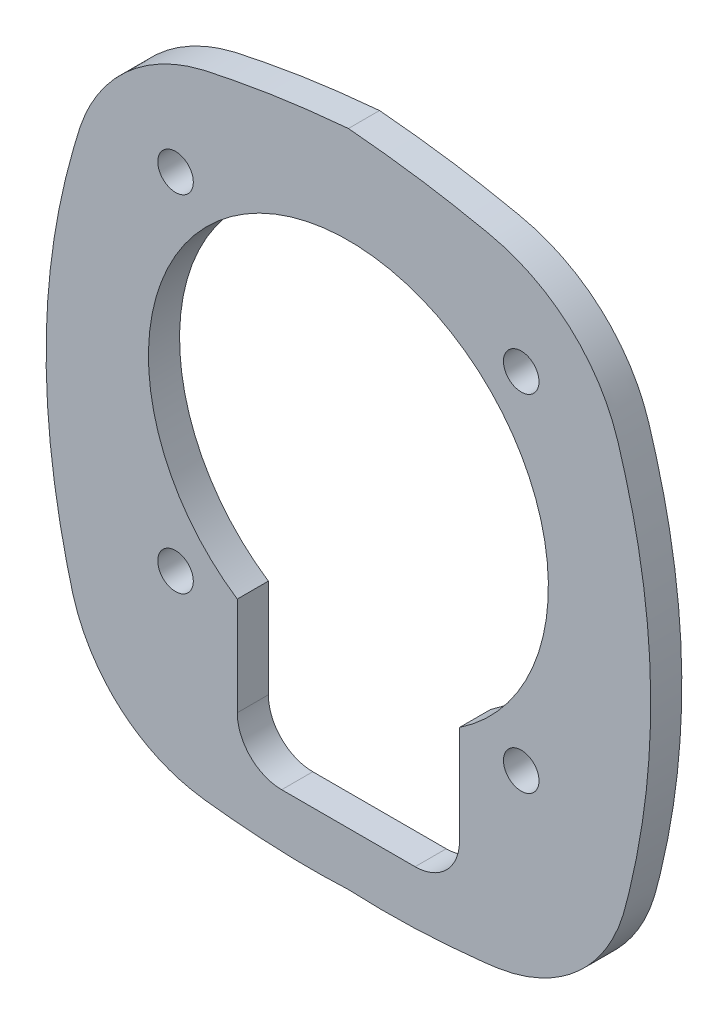
ISO-10303-21;
HEADER;
FILE_DESCRIPTION(('STEP AP214'),'2;1');
FILE_NAME('part.step','',(''),(''),'','','');
FILE_SCHEMA(('AUTOMOTIVE_DESIGN { 1 0 10303 214 1 1 1 1 }'));
ENDSEC;
DATA;
#1=APPLICATION_CONTEXT('core data for automotive mechanical design processes');
#2=APPLICATION_PROTOCOL_DEFINITION('international standard','automotive_design',2000,#1);
#3=PRODUCT_CONTEXT('',#1,'mechanical');
#4=PRODUCT('Part','Part','',(#3));
#5=PRODUCT_RELATED_PRODUCT_CATEGORY('part','',(#4));
#6=PRODUCT_DEFINITION_FORMATION('','',#4);
#7=PRODUCT_DEFINITION_CONTEXT('part definition',#1,'design');
#8=PRODUCT_DEFINITION('design','',#6,#7);
#9=PRODUCT_DEFINITION_SHAPE('','',#8);
#10=(LENGTH_UNIT() NAMED_UNIT(*) SI_UNIT(.MILLI.,.METRE.));
#11=(NAMED_UNIT(*) PLANE_ANGLE_UNIT() SI_UNIT($,.RADIAN.));
#12=(NAMED_UNIT(*) SI_UNIT($,.STERADIAN.) SOLID_ANGLE_UNIT());
#13=UNCERTAINTY_MEASURE_WITH_UNIT(LENGTH_MEASURE(1.E-05),#10,'distance_accuracy_value','');
#14=(GEOMETRIC_REPRESENTATION_CONTEXT(3) GLOBAL_UNCERTAINTY_ASSIGNED_CONTEXT((#13)) GLOBAL_UNIT_ASSIGNED_CONTEXT((#10,
#11,#12)) REPRESENTATION_CONTEXT('',''));
#15=CARTESIAN_POINT('',(0.,0.,0.));
#16=DIRECTION('',(0.,0.,1.));
#17=DIRECTION('',(1.,0.,0.));
#18=AXIS2_PLACEMENT_3D('',#15,#16,#17);
#19=CARTESIAN_POINT('',(0.00054299993692983,130.358525826866,1.4));
#20=CARTESIAN_POINT('',(-1.94548045190582,130.188499041734,1.4));
#21=CARTESIAN_POINT('',(-4.85838125316113,129.868758565136,1.4));
#22=CARTESIAN_POINT('',(-8.72241348746512,129.258161877485,1.4));
#23=CARTESIAN_POINT('',(-11.1223479499157,128.79259530496,1.4));
#24=CARTESIAN_POINT('',(-13.0358684318198,128.409370125319,1.4));
#25=CARTESIAN_POINT('',(-15.0232197505455,127.849253360925,1.4));
#26=CARTESIAN_POINT('',(-17.3517729758326,126.800885079784,1.4));
#27=CARTESIAN_POINT('',(-19.8740124159007,125.013083486646,1.4));
#28=CARTESIAN_POINT('',(-21.9836929339057,122.745525762715,1.4));
#29=CARTESIAN_POINT('',(-23.315799927982,120.550392171529,1.4));
#30=CARTESIAN_POINT('',(-24.0970656523542,118.633733215078,1.4));
#31=CARTESIAN_POINT('',(-24.6644840943337,116.740013737951,1.4));
#32=CARTESIAN_POINT('',(-25.3246455713415,114.384544217366,1.4));
#33=CARTESIAN_POINT('',(-26.1998346574846,110.552455159737,1.4));
#34=CARTESIAN_POINT('',(-26.9602033243545,105.695351510189,1.4));
#35=CARTESIAN_POINT('',(-27.3032190255383,99.799698553992,1.4));
#36=CARTESIAN_POINT('',(-27.1111267756914,94.8853222176447,1.4));
#37=CARTESIAN_POINT('',(-26.6923251134672,90.9810374384789,1.4));
#38=CARTESIAN_POINT('',(-26.2472832330215,88.0691838092408,1.4));
#39=CARTESIAN_POINT('',(-25.7782550087314,85.666957643433,1.4));
#40=CARTESIAN_POINT('',(-25.3390188687473,83.7483132972807,1.4));
#41=CARTESIAN_POINT('',(-24.9959659621823,82.3390638678443,1.4));
#42=CARTESIAN_POINT('',(-24.5760097029026,80.8595948727171,1.4));
#43=CARTESIAN_POINT('',(-23.7922149835983,78.961000016101,1.4));
#44=CARTESIAN_POINT('',(-22.4474494101588,76.7543305101135,1.4));
#45=CARTESIAN_POINT('',(-20.2746228224085,74.5172981645998,1.4));
#46=CARTESIAN_POINT('',(-17.6592329689269,72.8343581699906,1.4));
#47=CARTESIAN_POINT('',(-15.232095848419,71.94673096763,1.4));
#48=CARTESIAN_POINT('',(-13.2018471792175,71.5690279829804,1.4));
#49=CARTESIAN_POINT('',(-11.2484200492786,71.3654921754065,1.4));
#50=CARTESIAN_POINT('',(-8.8190330044732,71.1349679085005,1.4));
#51=CARTESIAN_POINT('',(-5.88212968687609,70.975232523235,1.4));
#52=CARTESIAN_POINT('',(-2.94056055903832,70.9248960887929,1.4));
#53=CARTESIAN_POINT('',(-0.980653766512998,70.9864573687039,1.4));
#54=CARTESIAN_POINT('',(-0.00147850116347067,71.0305909363643,1.4));
#55=B_SPLINE_CURVE_WITH_KNOTS('',3,(#19,#20,#21,#22,#23,#24,#25,#26,#27,#28,#29,#30,#31,#32,#33,
#34,#35,#36,#37,#38,#39,#40,#41,#42,#43,#44,#45,#46,#47,#48,#49,#50,#51,#52,#53,#54),
.UNSPECIFIED.,.F.,.F.,(4,1,1,1,1,1,1,1,1,1,1,1,1,1,1,1,1,1,1,1,1,1,1,1,1,1,1,1,1,1,1,1,1,4),
(-0.000757093376789677,0.0617650105254969,0.0930260624766402,0.124287114427783,
0.139917640403355,0.155548166378927,0.18680921833007,0.218070270281213,0.249331322232357,
0.2805923741835,0.296222900159072,0.311853426134643,0.343114478085787,0.37437553003693,
0.436897633939216,0.499419737841503,0.56194184174379,0.593202893694933,0.624463945646076,
0.655724997597219,0.671355523572791,0.686986049548363,0.702616575523934,0.718247101499506,
0.749508153450649,0.780769205401793,0.812030257352936,0.843291309304079,0.858921835279651,
0.874552361255223,0.905813413206366,0.937074465157509,0.968335517108652,0.999596569059796),.UNSPECIFIED.);
#56=DIRECTION('',(0.,0.,-1.));
#57=VECTOR('',#56,1.);
#58=SURFACE_OF_LINEAR_EXTRUSION('',#55,#57);
#59=CARTESIAN_POINT('',(0.00054299993692983,130.358525826866,-1.4));
#60=CARTESIAN_POINT('',(-1.94548045190582,130.188499041734,-1.4));
#61=CARTESIAN_POINT('',(-4.85838125316113,129.868758565136,-1.4));
#62=CARTESIAN_POINT('',(-8.72241348746512,129.258161877485,-1.4));
#63=CARTESIAN_POINT('',(-11.1223479499157,128.79259530496,-1.4));
#64=CARTESIAN_POINT('',(-13.0358684318198,128.409370125319,-1.4));
#65=CARTESIAN_POINT('',(-15.0232197505455,127.849253360925,-1.4));
#66=CARTESIAN_POINT('',(-17.3517729758326,126.800885079784,-1.4));
#67=CARTESIAN_POINT('',(-19.8740124159007,125.013083486646,-1.4));
#68=CARTESIAN_POINT('',(-21.9836929339057,122.745525762715,-1.4));
#69=CARTESIAN_POINT('',(-23.315799927982,120.550392171529,-1.4));
#70=CARTESIAN_POINT('',(-24.0970656523542,118.633733215078,-1.4));
#71=CARTESIAN_POINT('',(-24.6644840943337,116.740013737951,-1.4));
#72=CARTESIAN_POINT('',(-25.3246455713415,114.384544217366,-1.4));
#73=CARTESIAN_POINT('',(-26.1998346574846,110.552455159737,-1.4));
#74=CARTESIAN_POINT('',(-26.9602033243545,105.695351510189,-1.4));
#75=CARTESIAN_POINT('',(-27.3032190255383,99.799698553992,-1.4));
#76=CARTESIAN_POINT('',(-27.1111267756914,94.8853222176447,-1.4));
#77=CARTESIAN_POINT('',(-26.6923251134672,90.9810374384789,-1.4));
#78=CARTESIAN_POINT('',(-26.2472832330215,88.0691838092408,-1.4));
#79=CARTESIAN_POINT('',(-25.7782550087314,85.666957643433,-1.4));
#80=CARTESIAN_POINT('',(-25.3390188687473,83.7483132972807,-1.4));
#81=CARTESIAN_POINT('',(-24.9959659621823,82.3390638678443,-1.4));
#82=CARTESIAN_POINT('',(-24.5760097029026,80.8595948727171,-1.4));
#83=CARTESIAN_POINT('',(-23.7922149835983,78.961000016101,-1.4));
#84=CARTESIAN_POINT('',(-22.4474494101588,76.7543305101135,-1.4));
#85=CARTESIAN_POINT('',(-20.2746228224085,74.5172981645998,-1.4));
#86=CARTESIAN_POINT('',(-17.6592329689269,72.8343581699906,-1.4));
#87=CARTESIAN_POINT('',(-15.232095848419,71.94673096763,-1.4));
#88=CARTESIAN_POINT('',(-13.2018471792175,71.5690279829804,-1.4));
#89=CARTESIAN_POINT('',(-11.2484200492786,71.3654921754065,-1.4));
#90=CARTESIAN_POINT('',(-8.8190330044732,71.1349679085005,-1.4));
#91=CARTESIAN_POINT('',(-5.88212968687609,70.975232523235,-1.4));
#92=CARTESIAN_POINT('',(-2.94056055903832,70.9248960887929,-1.4));
#93=CARTESIAN_POINT('',(-0.980653766512998,70.9864573687039,-1.4));
#94=CARTESIAN_POINT('',(-0.00147850116347067,71.0305909363643,-1.4));
#95=B_SPLINE_CURVE_WITH_KNOTS('',3,(#59,#60,#61,#62,#63,#64,#65,#66,#67,#68,#69,#70,#71,#72,#73,
#74,#75,#76,#77,#78,#79,#80,#81,#82,#83,#84,#85,#86,#87,#88,#89,#90,#91,#92,#93,#94),
.UNSPECIFIED.,.F.,.F.,(4,1,1,1,1,1,1,1,1,1,1,1,1,1,1,1,1,1,1,1,1,1,1,1,1,1,1,1,1,1,1,1,1,4),
(-0.000757093376789677,0.0617650105254969,0.0930260624766402,0.124287114427783,
0.139917640403355,0.155548166378927,0.18680921833007,0.218070270281213,0.249331322232357,
0.2805923741835,0.296222900159072,0.311853426134643,0.343114478085787,0.37437553003693,
0.436897633939216,0.499419737841503,0.56194184174379,0.593202893694933,0.624463945646076,
0.655724997597219,0.671355523572791,0.686986049548363,0.702616575523934,0.718247101499506,
0.749508153450649,0.780769205401793,0.812030257352936,0.843291309304079,0.858921835279651,
0.874552361255223,0.905813413206366,0.937074465157509,0.968335517108652,0.999596569059796),.UNSPECIFIED.);
#96=CARTESIAN_POINT('',(0.00054299993692983,130.358525826866,-1.4));
#97=VERTEX_POINT('',#96);
#98=CARTESIAN_POINT('',(-0.00147850116347067,71.0305909363643,-1.4));
#99=VERTEX_POINT('',#98);
#100=EDGE_CURVE('E318',#97,#99,#95,.T.);
#101=ORIENTED_EDGE('',*,*,#100,.T.);
#102=DIRECTION('',(0.,0.,-1.));
#103=VECTOR('',#102,1.);
#104=CARTESIAN_POINT('',(-0.00147850116347067,71.0305909363643,1.4));
#105=LINE('',#104,#103);
#106=CARTESIAN_POINT('',(-0.00147850116347067,71.0305909363643,1.4));
#107=VERTEX_POINT('',#106);
#108=EDGE_CURVE('E11',#107,#99,#105,.T.);
#109=ORIENTED_EDGE('',*,*,#108,.F.);
#110=CARTESIAN_POINT('',(0.00054299993692983,130.358525826866,1.4));
#111=VERTEX_POINT('',#110);
#112=EDGE_CURVE('E156',#111,#107,#55,.T.);
#113=ORIENTED_EDGE('',*,*,#112,.F.);
#114=DIRECTION('',(0.,0.,-1.));
#115=VECTOR('',#114,1.);
#116=CARTESIAN_POINT('',(0.00054299993692983,130.358525826866,1.4));
#117=LINE('',#116,#115);
#118=EDGE_CURVE('E50',#111,#97,#117,.T.);
#119=ORIENTED_EDGE('',*,*,#118,.T.);
#120=EDGE_LOOP('',(#101,#109,#113,#119));
#121=FACE_BOUND('',#120,.T.);
#122=ADVANCED_FACE('F39',(#121),#58,.F.);
#123=CARTESIAN_POINT('',(0.,75.8120442507033,1.4));
#124=DIRECTION('',(0.,1.,0.));
#125=DIRECTION('',(0.,0.,1.));
#126=AXIS2_PLACEMENT_3D('',#123,#124,#125);
#127=PLANE('',#126);
#128=DIRECTION('',(1.,0.,0.));
#129=VECTOR('',#128,1.);
#130=CARTESIAN_POINT('',(0.,75.8120442507033,-1.4));
#131=LINE('',#130,#129);
#132=CARTESIAN_POINT('',(-6.00491041095505,75.8120442507033,-1.4));
#133=VERTEX_POINT('',#132);
#134=CARTESIAN_POINT('',(6.00195340862822,75.8120442507033,-1.4));
#135=VERTEX_POINT('',#134);
#136=EDGE_CURVE('E305',#133,#135,#131,.T.);
#137=ORIENTED_EDGE('',*,*,#136,.F.);
#138=DIRECTION('',(0.,0.,-1.));
#139=VECTOR('',#138,1.);
#140=CARTESIAN_POINT('',(-6.00491041095505,75.8120442507033,1.4));
#141=LINE('',#140,#139);
#142=CARTESIAN_POINT('',(-6.00491041095505,75.8120442507033,1.4));
#143=VERTEX_POINT('',#142);
#144=EDGE_CURVE('E43',#143,#133,#141,.T.);
#145=ORIENTED_EDGE('',*,*,#144,.F.);
#146=DIRECTION('',(1.,0.,0.));
#147=VECTOR('',#146,1.);
#148=CARTESIAN_POINT('',(0.,75.8120442507033,1.4));
#149=LINE('',#148,#147);
#150=CARTESIAN_POINT('',(6.00195340862822,75.8120442507033,1.4));
#151=VERTEX_POINT('',#150);
#152=EDGE_CURVE('E123',#143,#151,#149,.T.);
#153=ORIENTED_EDGE('',*,*,#152,.T.);
#154=DIRECTION('',(0.,0.,-1.));
#155=VECTOR('',#154,1.);
#156=CARTESIAN_POINT('',(6.00195340862822,75.8120442507033,1.4));
#157=LINE('',#156,#155);
#158=EDGE_CURVE('E112',#151,#135,#157,.T.);
#159=ORIENTED_EDGE('',*,*,#158,.T.);
#160=EDGE_LOOP('',(#137,#145,#153,#159));
#161=FACE_BOUND('',#160,.T.);
#162=ADVANCED_FACE('F124',(#161),#127,.T.);
#163=CARTESIAN_POINT('',(-6.00491041095508,79.8120442507034,1.4));
#164=DIRECTION('',(0.,0.,-1.));
#165=DIRECTION('',(-1.,0.,0.));
#166=AXIS2_PLACEMENT_3D('',#163,#164,#165);
#167=CYLINDRICAL_SURFACE('',#166,4.);
#168=CARTESIAN_POINT('',(-6.00491041095508,79.8120442507034,-1.4));
#169=DIRECTION('',(0.,0.,1.));
#170=DIRECTION('',(1.,0.,0.));
#171=AXIS2_PLACEMENT_3D('',#168,#169,#170);
#172=CIRCLE('',#171,4.);
#173=CARTESIAN_POINT('',(-10.0049104109551,79.8120442507034,-1.4));
#174=VERTEX_POINT('',#173);
#175=EDGE_CURVE('E354',#133,#174,#172,.F.);
#176=ORIENTED_EDGE('',*,*,#175,.T.);
#177=DIRECTION('',(0.,0.,-1.));
#178=VECTOR('',#177,1.);
#179=CARTESIAN_POINT('',(-10.0049104109551,79.8120442507034,1.4));
#180=LINE('',#179,#178);
#181=CARTESIAN_POINT('',(-10.0049104109551,79.8120442507034,1.4));
#182=VERTEX_POINT('',#181);
#183=EDGE_CURVE('E347',#182,#174,#180,.T.);
#184=ORIENTED_EDGE('',*,*,#183,.F.);
#185=CARTESIAN_POINT('',(-6.00491041095508,79.8120442507034,1.4));
#186=DIRECTION('',(0.,0.,1.));
#187=DIRECTION('',(1.,0.,0.));
#188=AXIS2_PLACEMENT_3D('',#185,#186,#187);
#189=CIRCLE('',#188,4.);
#190=EDGE_CURVE('E128',#143,#182,#189,.F.);
#191=ORIENTED_EDGE('',*,*,#190,.F.);
#192=ORIENTED_EDGE('',*,*,#144,.T.);
#193=EDGE_LOOP('',(#176,#184,#191,#192));
#194=FACE_BOUND('',#193,.T.);
#195=ADVANCED_FACE('F201',(#194),#167,.F.);
#196=CARTESIAN_POINT('',(-10.0049104109551,0.,1.4));
#197=DIRECTION('',(-1.,0.,0.));
#198=DIRECTION('',(0.,0.,1.));
#199=AXIS2_PLACEMENT_3D('',#196,#197,#198);
#200=PLANE('',#199);
#201=DIRECTION('',(0.,1.,0.));
#202=VECTOR('',#201,1.);
#203=CARTESIAN_POINT('',(-10.0049104109551,0.,-1.4));
#204=LINE('',#203,#202);
#205=CARTESIAN_POINT('',(-10.0049104109551,88.6735975452472,-1.4));
#206=VERTEX_POINT('',#205);
#207=EDGE_CURVE('E356',#174,#206,#204,.T.);
#208=ORIENTED_EDGE('',*,*,#207,.T.);
#209=DIRECTION('',(0.,0.,-1.));
#210=VECTOR('',#209,1.);
#211=CARTESIAN_POINT('',(-10.0049104109551,88.6735975452472,1.4));
#212=LINE('',#211,#210);
#213=CARTESIAN_POINT('',(-10.0049104109551,88.6735975452472,1.4));
#214=VERTEX_POINT('',#213);
#215=EDGE_CURVE('E345',#214,#206,#212,.T.);
#216=ORIENTED_EDGE('',*,*,#215,.F.);
#217=DIRECTION('',(0.,1.,0.));
#218=VECTOR('',#217,1.);
#219=CARTESIAN_POINT('',(-10.0049104109551,0.,1.4));
#220=LINE('',#219,#218);
#221=EDGE_CURVE('E381',#182,#214,#220,.T.);
#222=ORIENTED_EDGE('',*,*,#221,.F.);
#223=ORIENTED_EDGE('',*,*,#183,.T.);
#224=EDGE_LOOP('',(#208,#216,#222,#223));
#225=FACE_BOUND('',#224,.T.);
#226=ADVANCED_FACE('F197',(#225),#200,.F.);
#227=CARTESIAN_POINT('',(0.,103.636945020621,1.4));
#228=DIRECTION('',(0.,0.,-1.));
#229=DIRECTION('',(-1.,0.,0.));
#230=AXIS2_PLACEMENT_3D('',#227,#228,#229);
#231=CYLINDRICAL_SURFACE('',#230,18.);
#232=CARTESIAN_POINT('',(0.,103.636945020621,-1.4));
#233=DIRECTION('',(0.,0.,1.));
#234=DIRECTION('',(1.,0.,0.));
#235=AXIS2_PLACEMENT_3D('',#232,#233,#234);
#236=CIRCLE('',#235,18.);
#237=CARTESIAN_POINT('',(10.0019534086282,88.6716208339673,-1.4));
#238=VERTEX_POINT('',#237);
#239=EDGE_CURVE('E365',#238,#206,#236,.T.);
#240=ORIENTED_EDGE('',*,*,#239,.F.);
#241=DIRECTION('',(0.,0.,-1.));
#242=VECTOR('',#241,1.);
#243=CARTESIAN_POINT('',(10.0019534086282,88.6716208339673,1.4));
#244=LINE('',#243,#242);
#245=CARTESIAN_POINT('',(10.0019534086282,88.6716208339673,1.4));
#246=VERTEX_POINT('',#245);
#247=EDGE_CURVE('E342',#246,#238,#244,.T.);
#248=ORIENTED_EDGE('',*,*,#247,.F.);
#249=CARTESIAN_POINT('',(0.,103.636945020621,1.4));
#250=DIRECTION('',(0.,0.,1.));
#251=DIRECTION('',(1.,0.,0.));
#252=AXIS2_PLACEMENT_3D('',#249,#250,#251);
#253=CIRCLE('',#252,18.);
#254=EDGE_CURVE('E145',#246,#214,#253,.T.);
#255=ORIENTED_EDGE('',*,*,#254,.T.);
#256=ORIENTED_EDGE('',*,*,#215,.T.);
#257=EDGE_LOOP('',(#240,#248,#255,#256));
#258=FACE_BOUND('',#257,.T.);
#259=ADVANCED_FACE('F193',(#258),#231,.F.);
#260=CARTESIAN_POINT('',(10.0019534086282,0.,1.4));
#261=DIRECTION('',(-1.,0.,0.));
#262=DIRECTION('',(0.,0.,1.));
#263=AXIS2_PLACEMENT_3D('',#260,#261,#262);
#264=PLANE('',#263);
#265=DIRECTION('',(0.,1.,0.));
#266=VECTOR('',#265,1.);
#267=CARTESIAN_POINT('',(10.0019534086282,0.,-1.4));
#268=LINE('',#267,#266);
#269=CARTESIAN_POINT('',(10.0019534086282,79.8120442507034,-1.4));
#270=VERTEX_POINT('',#269);
#271=EDGE_CURVE('E368',#270,#238,#268,.T.);
#272=ORIENTED_EDGE('',*,*,#271,.F.);
#273=DIRECTION('',(0.,0.,-1.));
#274=VECTOR('',#273,1.);
#275=CARTESIAN_POINT('',(10.0019534086282,79.8120442507034,1.4));
#276=LINE('',#275,#274);
#277=CARTESIAN_POINT('',(10.0019534086282,79.8120442507034,1.4));
#278=VERTEX_POINT('',#277);
#279=EDGE_CURVE('E120',#278,#270,#276,.T.);
#280=ORIENTED_EDGE('',*,*,#279,.F.);
#281=DIRECTION('',(0.,1.,0.));
#282=VECTOR('',#281,1.);
#283=CARTESIAN_POINT('',(10.0019534086282,0.,1.4));
#284=LINE('',#283,#282);
#285=EDGE_CURVE('E136',#278,#246,#284,.T.);
#286=ORIENTED_EDGE('',*,*,#285,.T.);
#287=ORIENTED_EDGE('',*,*,#247,.T.);
#288=EDGE_LOOP('',(#272,#280,#286,#287));
#289=FACE_BOUND('',#288,.T.);
#290=ADVANCED_FACE('F180',(#289),#264,.T.);
#291=CARTESIAN_POINT('',(-15.5593061884308,88.0805958345165,1.4));
#292=DIRECTION('',(0.,0.,-1.));
#293=DIRECTION('',(-1.,0.,0.));
#294=AXIS2_PLACEMENT_3D('',#291,#292,#293);
#295=CYLINDRICAL_SURFACE('',#294,1.6);
#296=CARTESIAN_POINT('',(-15.5593061884308,88.0805958345165,1.4));
#297=DIRECTION('',(0.,0.,1.));
#298=DIRECTION('',(1.,0.,0.));
#299=AXIS2_PLACEMENT_3D('',#296,#297,#298);
#300=CIRCLE('',#299,1.6);
#301=CARTESIAN_POINT('',(-13.9593061884308,88.0805958345165,1.4));
#302=VERTEX_POINT('',#301);
#303=EDGE_CURVE('E152',#302,#302,#300,.T.);
#304=ORIENTED_EDGE('',*,*,#303,.T.);
#305=EDGE_LOOP('',(#304));
#306=FACE_BOUND('',#305,.T.);
#307=CARTESIAN_POINT('',(-15.5593061884308,88.0805958345165,-1.4));
#308=DIRECTION('',(0.,0.,1.));
#309=DIRECTION('',(1.,0.,0.));
#310=AXIS2_PLACEMENT_3D('',#307,#308,#309);
#311=CIRCLE('',#310,1.6);
#312=CARTESIAN_POINT('',(-13.9593061884308,88.0805958345165,-1.4));
#313=VERTEX_POINT('',#312);
#314=EDGE_CURVE('E316',#313,#313,#311,.T.);
#315=ORIENTED_EDGE('',*,*,#314,.F.);
#316=EDGE_LOOP('',(#315));
#317=FACE_BOUND('',#316,.T.);
#318=ADVANCED_FACE('F176',(#306,#317),#295,.F.);
#319=CARTESIAN_POINT('',(-15.5593061884308,119.193294206725,1.4));
#320=DIRECTION('',(0.,0.,-1.));
#321=DIRECTION('',(-1.,0.,0.));
#322=AXIS2_PLACEMENT_3D('',#319,#320,#321);
#323=CYLINDRICAL_SURFACE('',#322,1.6);
#324=CARTESIAN_POINT('',(-15.5593061884308,119.193294206725,1.4));
#325=DIRECTION('',(0.,0.,1.));
#326=DIRECTION('',(1.,0.,0.));
#327=AXIS2_PLACEMENT_3D('',#324,#325,#326);
#328=CIRCLE('',#327,1.6);
#329=CARTESIAN_POINT('',(-13.9593061884308,119.193294206725,1.4));
#330=VERTEX_POINT('',#329);
#331=EDGE_CURVE('E143',#330,#330,#328,.F.);
#332=ORIENTED_EDGE('',*,*,#331,.F.);
#333=EDGE_LOOP('',(#332));
#334=FACE_BOUND('',#333,.T.);
#335=CARTESIAN_POINT('',(-15.5593061884308,119.193294206725,-1.4));
#336=DIRECTION('',(0.,0.,1.));
#337=DIRECTION('',(1.,0.,0.));
#338=AXIS2_PLACEMENT_3D('',#335,#336,#337);
#339=CIRCLE('',#338,1.6);
#340=CARTESIAN_POINT('',(-13.9593061884308,119.193294206725,-1.4));
#341=VERTEX_POINT('',#340);
#342=EDGE_CURVE('E313',#341,#341,#339,.F.);
#343=ORIENTED_EDGE('',*,*,#342,.T.);
#344=EDGE_LOOP('',(#343));
#345=FACE_BOUND('',#344,.T.);
#346=ADVANCED_FACE('F179',(#334,#345),#323,.F.);
#347=CARTESIAN_POINT('',(15.556349186104,119.193294206725,1.4));
#348=DIRECTION('',(0.,0.,-1.));
#349=DIRECTION('',(-1.,0.,0.));
#350=AXIS2_PLACEMENT_3D('',#347,#348,#349);
#351=CYLINDRICAL_SURFACE('',#350,1.6);
#352=CARTESIAN_POINT('',(15.556349186104,119.193294206725,1.4));
#353=DIRECTION('',(0.,0.,1.));
#354=DIRECTION('',(1.,0.,0.));
#355=AXIS2_PLACEMENT_3D('',#352,#353,#354);
#356=CIRCLE('',#355,1.6);
#357=CARTESIAN_POINT('',(17.156349186104,119.193294206725,1.4));
#358=VERTEX_POINT('',#357);
#359=EDGE_CURVE('E138',#358,#358,#356,.T.);
#360=ORIENTED_EDGE('',*,*,#359,.T.);
#361=EDGE_LOOP('',(#360));
#362=FACE_BOUND('',#361,.T.);
#363=CARTESIAN_POINT('',(15.556349186104,119.193294206725,-1.4));
#364=DIRECTION('',(0.,0.,1.));
#365=DIRECTION('',(1.,0.,0.));
#366=AXIS2_PLACEMENT_3D('',#363,#364,#365);
#367=CIRCLE('',#366,1.6);
#368=CARTESIAN_POINT('',(17.156349186104,119.193294206725,-1.4));
#369=VERTEX_POINT('',#368);
#370=EDGE_CURVE('E309',#369,#369,#367,.T.);
#371=ORIENTED_EDGE('',*,*,#370,.F.);
#372=EDGE_LOOP('',(#371));
#373=FACE_BOUND('',#372,.T.);
#374=ADVANCED_FACE('F184',(#362,#373),#351,.F.);
#375=CARTESIAN_POINT('',(6.00195340862825,79.8120442507034,1.4));
#376=DIRECTION('',(0.,0.,-1.));
#377=DIRECTION('',(-1.,0.,0.));
#378=AXIS2_PLACEMENT_3D('',#375,#376,#377);
#379=CYLINDRICAL_SURFACE('',#378,4.);
#380=CARTESIAN_POINT('',(6.00195340862825,79.8120442507034,-1.4));
#381=DIRECTION('',(0.,0.,1.));
#382=DIRECTION('',(1.,0.,0.));
#383=AXIS2_PLACEMENT_3D('',#380,#381,#382);
#384=CIRCLE('',#383,4.);
#385=EDGE_CURVE('E117',#135,#270,#384,.T.);
#386=ORIENTED_EDGE('',*,*,#385,.F.);
#387=ORIENTED_EDGE('',*,*,#158,.F.);
#388=CARTESIAN_POINT('',(6.00195340862825,79.8120442507034,1.4));
#389=DIRECTION('',(0.,0.,1.));
#390=DIRECTION('',(1.,0.,0.));
#391=AXIS2_PLACEMENT_3D('',#388,#389,#390);
#392=CIRCLE('',#391,4.);
#393=EDGE_CURVE('E115',#151,#278,#392,.T.);
#394=ORIENTED_EDGE('',*,*,#393,.T.);
#395=ORIENTED_EDGE('',*,*,#279,.T.);
#396=EDGE_LOOP('',(#386,#387,#394,#395));
#397=FACE_BOUND('',#396,.T.);
#398=ADVANCED_FACE('F113',(#397),#379,.F.);
#399=CARTESIAN_POINT('',(15.556349186104,88.0805958345165,1.4));
#400=DIRECTION('',(0.,0.,-1.));
#401=DIRECTION('',(-1.,0.,0.));
#402=AXIS2_PLACEMENT_3D('',#399,#400,#401);
#403=CYLINDRICAL_SURFACE('',#402,1.6);
#404=CARTESIAN_POINT('',(15.556349186104,88.0805958345165,1.4));
#405=DIRECTION('',(0.,0.,1.));
#406=DIRECTION('',(1.,0.,0.));
#407=AXIS2_PLACEMENT_3D('',#404,#405,#406);
#408=CIRCLE('',#407,1.6);
#409=CARTESIAN_POINT('',(17.156349186104,88.0805958345165,1.4));
#410=VERTEX_POINT('',#409);
#411=EDGE_CURVE('E129',#410,#410,#408,.F.);
#412=ORIENTED_EDGE('',*,*,#411,.F.);
#413=EDGE_LOOP('',(#412));
#414=FACE_BOUND('',#413,.T.);
#415=CARTESIAN_POINT('',(15.556349186104,88.0805958345165,-1.4));
#416=DIRECTION('',(0.,0.,1.));
#417=DIRECTION('',(1.,0.,0.));
#418=AXIS2_PLACEMENT_3D('',#415,#416,#417);
#419=CIRCLE('',#418,1.6);
#420=CARTESIAN_POINT('',(17.156349186104,88.0805958345165,-1.4));
#421=VERTEX_POINT('',#420);
#422=EDGE_CURVE('E302',#421,#421,#419,.F.);
#423=ORIENTED_EDGE('',*,*,#422,.T.);
#424=EDGE_LOOP('',(#423));
#425=FACE_BOUND('',#424,.T.);
#426=ADVANCED_FACE('F41',(#414,#425),#403,.F.);
#427=CARTESIAN_POINT('',(-0.00147850116341491,71.0305909363643,1.4));
#428=CARTESIAN_POINT('',(1.95712441042826,70.9350805505064,1.4));
#429=CARTESIAN_POINT('',(4.90472947995543,70.9199513695517,1.4));
#430=CARTESIAN_POINT('',(8.81666181792318,71.1354663379446,1.4));
#431=CARTESIAN_POINT('',(11.2546039585983,71.3649755857975,1.4));
#432=CARTESIAN_POINT('',(13.1960748258513,71.5696698000313,1.4));
#433=CARTESIAN_POINT('',(15.2349350393485,71.9462089270097,1.4));
#434=CARTESIAN_POINT('',(17.6573452009138,72.8340602887437,1.4));
#435=CARTESIAN_POINT('',(20.2745342472153,74.5172091740496,1.4));
#436=CARTESIAN_POINT('',(22.447305020923,76.7537541960112,1.4));
#437=CARTESIAN_POINT('',(23.7914583962657,78.9599961304181,1.4));
#438=CARTESIAN_POINT('',(24.5757131546901,80.8579102044458,1.4));
#439=CARTESIAN_POINT('',(24.9949147011838,82.3360195430029,1.4));
#440=CARTESIAN_POINT('',(25.3392996881973,83.7482056858305,1.4));
#441=CARTESIAN_POINT('',(25.7774482374276,85.6645000270034,1.4));
#442=CARTESIAN_POINT('',(26.2472703805184,88.0681710078518,1.4));
#443=CARTESIAN_POINT('',(26.6919129625535,90.9794941939274,1.4));
#444=CARTESIAN_POINT('',(27.1111584699283,94.8836924272437,1.4));
#445=CARTESIAN_POINT('',(27.3030519952215,99.7987712535742,1.4));
#446=CARTESIAN_POINT('',(26.9606683787532,105.691319230423,1.4));
#447=CARTESIAN_POINT('',(26.2003669809981,110.548978068859,1.4));
#448=CARTESIAN_POINT('',(25.325712758389,114.381140724265,1.4));
#449=CARTESIAN_POINT('',(24.6652174294262,116.736075727386,1.4));
#450=CARTESIAN_POINT('',(24.0982496641225,118.630835966207,1.4));
#451=CARTESIAN_POINT('',(23.3178500588438,120.546267769718,1.4));
#452=CARTESIAN_POINT('',(21.9827675187499,122.747268843006,1.4));
#453=CARTESIAN_POINT('',(19.8732791359493,125.013547238869,1.4));
#454=CARTESIAN_POINT('',(17.351613221023,126.801120987864,1.4));
#455=CARTESIAN_POINT('',(15.0220720313751,127.849466553883,1.4));
#456=CARTESIAN_POINT('',(13.0373108291904,128.409258097043,1.4));
#457=CARTESIAN_POINT('',(11.1213583100819,128.792757062008,1.4));
#458=CARTESIAN_POINT('',(8.72255397038245,129.258080327242,1.4));
#459=CARTESIAN_POINT('',(4.85808444360239,129.869349057392,1.4));
#460=CARTESIAN_POINT('',(1.94595441149202,130.185901402211,1.4));
#461=CARTESIAN_POINT('',(0.000542999936884049,130.358525826866,1.4));
#462=B_SPLINE_CURVE_WITH_KNOTS('',3,(#427,#428,#429,#430,#431,#432,#433,#434,#435,#436,#437,
#438,#439,#440,#441,#442,#443,#444,#445,#446,#447,#448,#449,#450,#451,#452,#453,#454,#455,#456,
#457,#458,#459,#460,#461),.UNSPECIFIED.,.F.,.F.,(4,1,1,1,1,1,1,1,1,1,1,1,1,1,1,1,1,1,1,1,1,1,1,
1,1,1,1,1,1,1,1,1,4),(0.000403383321796334,0.0629254905988203,0.0941865442373322,
0.125447597875844,0.1410781246951,0.156708651514356,0.187969705152868,0.21923075879138,
0.250491812429892,0.281752866068404,0.29738339288766,0.313013919706916,0.328644446526172,
0.344274973345428,0.37553602698394,0.406797080622452,0.438058134260964,0.500580241537988,
0.563102348815012,0.625624456092036,0.656885509730548,0.68814656336906,0.703777090188316,
0.719407617007572,0.750668670646084,0.781929724284596,0.813190777923108,0.84445183156162,
0.860082358380876,0.875712885200132,0.906973938838644,0.938234992477156,1.00075709975418),.UNSPECIFIED.);
#463=DIRECTION('',(0.,0.,-1.));
#464=VECTOR('',#463,1.);
#465=SURFACE_OF_LINEAR_EXTRUSION('',#462,#464);
#466=CARTESIAN_POINT('',(-0.00147850116341491,71.0305909363643,-1.4));
#467=CARTESIAN_POINT('',(1.95712441042826,70.9350805505064,-1.4));
#468=CARTESIAN_POINT('',(4.90472947995543,70.9199513695517,-1.4));
#469=CARTESIAN_POINT('',(8.81666181792318,71.1354663379446,-1.4));
#470=CARTESIAN_POINT('',(11.2546039585983,71.3649755857975,-1.4));
#471=CARTESIAN_POINT('',(13.1960748258513,71.5696698000313,-1.4));
#472=CARTESIAN_POINT('',(15.2349350393485,71.9462089270097,-1.4));
#473=CARTESIAN_POINT('',(17.6573452009138,72.8340602887437,-1.4));
#474=CARTESIAN_POINT('',(20.2745342472153,74.5172091740496,-1.4));
#475=CARTESIAN_POINT('',(22.447305020923,76.7537541960112,-1.4));
#476=CARTESIAN_POINT('',(23.7914583962657,78.9599961304181,-1.4));
#477=CARTESIAN_POINT('',(24.5757131546901,80.8579102044458,-1.4));
#478=CARTESIAN_POINT('',(24.9949147011838,82.3360195430029,-1.4));
#479=CARTESIAN_POINT('',(25.3392996881973,83.7482056858305,-1.4));
#480=CARTESIAN_POINT('',(25.7774482374276,85.6645000270034,-1.4));
#481=CARTESIAN_POINT('',(26.2472703805184,88.0681710078518,-1.4));
#482=CARTESIAN_POINT('',(26.6919129625535,90.9794941939274,-1.4));
#483=CARTESIAN_POINT('',(27.1111584699283,94.8836924272437,-1.4));
#484=CARTESIAN_POINT('',(27.3030519952215,99.7987712535742,-1.4));
#485=CARTESIAN_POINT('',(26.9606683787532,105.691319230423,-1.4));
#486=CARTESIAN_POINT('',(26.2003669809981,110.548978068859,-1.4));
#487=CARTESIAN_POINT('',(25.325712758389,114.381140724265,-1.4));
#488=CARTESIAN_POINT('',(24.6652174294262,116.736075727386,-1.4));
#489=CARTESIAN_POINT('',(24.0982496641225,118.630835966207,-1.4));
#490=CARTESIAN_POINT('',(23.3178500588438,120.546267769718,-1.4));
#491=CARTESIAN_POINT('',(21.9827675187499,122.747268843006,-1.4));
#492=CARTESIAN_POINT('',(19.8732791359493,125.013547238869,-1.4));
#493=CARTESIAN_POINT('',(17.351613221023,126.801120987864,-1.4));
#494=CARTESIAN_POINT('',(15.0220720313751,127.849466553883,-1.4));
#495=CARTESIAN_POINT('',(13.0373108291904,128.409258097043,-1.4));
#496=CARTESIAN_POINT('',(11.1213583100819,128.792757062008,-1.4));
#497=CARTESIAN_POINT('',(8.72255397038245,129.258080327242,-1.4));
#498=CARTESIAN_POINT('',(4.85808444360239,129.869349057392,-1.4));
#499=CARTESIAN_POINT('',(1.94595441149202,130.185901402211,-1.4));
#500=CARTESIAN_POINT('',(0.000542999936884049,130.358525826866,-1.4));
#501=B_SPLINE_CURVE_WITH_KNOTS('',3,(#466,#467,#468,#469,#470,#471,#472,#473,#474,#475,#476,
#477,#478,#479,#480,#481,#482,#483,#484,#485,#486,#487,#488,#489,#490,#491,#492,#493,#494,#495,
#496,#497,#498,#499,#500),.UNSPECIFIED.,.F.,.F.,(4,1,1,1,1,1,1,1,1,1,1,1,1,1,1,1,1,1,1,1,1,1,1,
1,1,1,1,1,1,1,1,1,4),(0.000403383321796334,0.0629254905988203,0.0941865442373322,
0.125447597875844,0.1410781246951,0.156708651514356,0.187969705152868,0.21923075879138,
0.250491812429892,0.281752866068404,0.29738339288766,0.313013919706916,0.328644446526172,
0.344274973345428,0.37553602698394,0.406797080622452,0.438058134260964,0.500580241537988,
0.563102348815012,0.625624456092036,0.656885509730548,0.68814656336906,0.703777090188316,
0.719407617007572,0.750668670646084,0.781929724284596,0.813190777923108,0.84445183156162,
0.860082358380876,0.875712885200132,0.906973938838644,0.938234992477156,1.00075709975418),.UNSPECIFIED.);
#502=EDGE_CURVE('E86',#99,#97,#501,.T.);
#503=ORIENTED_EDGE('',*,*,#502,.T.);
#504=ORIENTED_EDGE('',*,*,#118,.F.);
#505=EDGE_CURVE('E58',#107,#111,#462,.T.);
#506=ORIENTED_EDGE('',*,*,#505,.F.);
#507=ORIENTED_EDGE('',*,*,#108,.T.);
#508=EDGE_LOOP('',(#503,#504,#506,#507));
#509=FACE_BOUND('',#508,.T.);
#510=ADVANCED_FACE('F174',(#509),#465,.F.);
#511=CARTESIAN_POINT('',(0.,0.,1.4));
#512=DIRECTION('',(0.,0.,1.));
#513=DIRECTION('',(1.,0.,0.));
#514=AXIS2_PLACEMENT_3D('',#511,#512,#513);
#515=PLANE('',#514);
#516=ORIENTED_EDGE('',*,*,#411,.T.);
#517=EDGE_LOOP('',(#516));
#518=FACE_BOUND('',#517,.T.);
#519=ORIENTED_EDGE('',*,*,#152,.F.);
#520=ORIENTED_EDGE('',*,*,#190,.T.);
#521=ORIENTED_EDGE('',*,*,#221,.T.);
#522=ORIENTED_EDGE('',*,*,#254,.F.);
#523=ORIENTED_EDGE('',*,*,#285,.F.);
#524=ORIENTED_EDGE('',*,*,#393,.F.);
#525=EDGE_LOOP('',(#519,#520,#521,#522,#523,#524));
#526=FACE_BOUND('',#525,.T.);
#527=ORIENTED_EDGE('',*,*,#359,.F.);
#528=EDGE_LOOP('',(#527));
#529=FACE_BOUND('',#528,.T.);
#530=ORIENTED_EDGE('',*,*,#331,.T.);
#531=EDGE_LOOP('',(#530));
#532=FACE_BOUND('',#531,.T.);
#533=ORIENTED_EDGE('',*,*,#303,.F.);
#534=EDGE_LOOP('',(#533));
#535=FACE_BOUND('',#534,.T.);
#536=ORIENTED_EDGE('',*,*,#112,.T.);
#537=ORIENTED_EDGE('',*,*,#505,.T.);
#538=EDGE_LOOP('',(#536,#537));
#539=FACE_BOUND('',#538,.T.);
#540=ADVANCED_FACE('F132',(#518,#526,#529,#532,#535,#539),#515,.T.);
#541=CARTESIAN_POINT('',(0.,0.,-1.4));
#542=DIRECTION('',(0.,0.,1.));
#543=DIRECTION('',(1.,0.,0.));
#544=AXIS2_PLACEMENT_3D('',#541,#542,#543);
#545=PLANE('',#544);
#546=ORIENTED_EDGE('',*,*,#422,.F.);
#547=EDGE_LOOP('',(#546));
#548=FACE_BOUND('',#547,.T.);
#549=ORIENTED_EDGE('',*,*,#136,.T.);
#550=ORIENTED_EDGE('',*,*,#385,.T.);
#551=ORIENTED_EDGE('',*,*,#271,.T.);
#552=ORIENTED_EDGE('',*,*,#239,.T.);
#553=ORIENTED_EDGE('',*,*,#207,.F.);
#554=ORIENTED_EDGE('',*,*,#175,.F.);
#555=EDGE_LOOP('',(#549,#550,#551,#552,#553,#554));
#556=FACE_BOUND('',#555,.T.);
#557=ORIENTED_EDGE('',*,*,#370,.T.);
#558=EDGE_LOOP('',(#557));
#559=FACE_BOUND('',#558,.T.);
#560=ORIENTED_EDGE('',*,*,#342,.F.);
#561=EDGE_LOOP('',(#560));
#562=FACE_BOUND('',#561,.T.);
#563=ORIENTED_EDGE('',*,*,#314,.T.);
#564=EDGE_LOOP('',(#563));
#565=FACE_BOUND('',#564,.T.);
#566=ORIENTED_EDGE('',*,*,#100,.F.);
#567=ORIENTED_EDGE('',*,*,#502,.F.);
#568=EDGE_LOOP('',(#566,#567));
#569=FACE_BOUND('',#568,.T.);
#570=ADVANCED_FACE('F259',(#548,#556,#559,#562,#565,#569),#545,.F.);
#571=CLOSED_SHELL('',(#122,#162,#195,#226,#259,#290,#318,#346,#374,#398,#426,#510,#540,#570));
#572=MANIFOLD_SOLID_BREP('B2',#571);
#573=ADVANCED_BREP_SHAPE_REPRESENTATION('',(#18,#572),#14);
#574=SHAPE_DEFINITION_REPRESENTATION(#9,#573);
ENDSEC;
END-ISO-10303-21;
